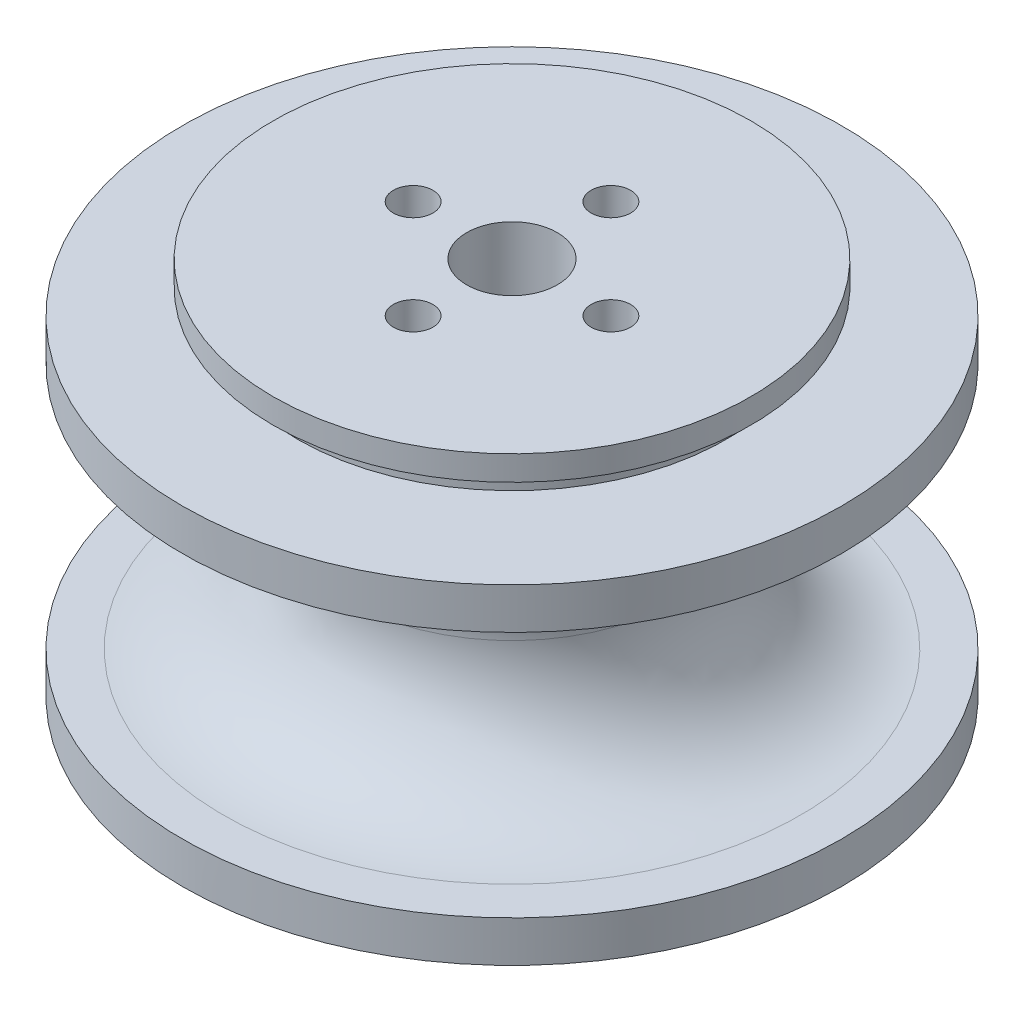
ISO-10303-21;
HEADER;
FILE_DESCRIPTION(('STEP AP214'),'2;1');
FILE_NAME('part.step','',(''),(''),'','','');
FILE_SCHEMA(('AUTOMOTIVE_DESIGN { 1 0 10303 214 1 1 1 1 }'));
ENDSEC;
DATA;
#1=APPLICATION_CONTEXT('core data for automotive mechanical design processes');
#2=APPLICATION_PROTOCOL_DEFINITION('international standard','automotive_design',2000,#1);
#3=PRODUCT_CONTEXT('',#1,'mechanical');
#4=PRODUCT('Part','Part','',(#3));
#5=PRODUCT_RELATED_PRODUCT_CATEGORY('part','',(#4));
#6=PRODUCT_DEFINITION_FORMATION('','',#4);
#7=PRODUCT_DEFINITION_CONTEXT('part definition',#1,'design');
#8=PRODUCT_DEFINITION('design','',#6,#7);
#9=PRODUCT_DEFINITION_SHAPE('','',#8);
#10=(LENGTH_UNIT() NAMED_UNIT(*) SI_UNIT(.MILLI.,.METRE.));
#11=(NAMED_UNIT(*) PLANE_ANGLE_UNIT() SI_UNIT($,.RADIAN.));
#12=(NAMED_UNIT(*) SI_UNIT($,.STERADIAN.) SOLID_ANGLE_UNIT());
#13=UNCERTAINTY_MEASURE_WITH_UNIT(LENGTH_MEASURE(1.E-05),#10,'distance_accuracy_value','');
#14=(GEOMETRIC_REPRESENTATION_CONTEXT(3) GLOBAL_UNCERTAINTY_ASSIGNED_CONTEXT((#13)) GLOBAL_UNIT_ASSIGNED_CONTEXT((#10,
#11,#12)) REPRESENTATION_CONTEXT('',''));
#15=CARTESIAN_POINT('',(0.,0.,0.));
#16=DIRECTION('',(0.,0.,1.));
#17=DIRECTION('',(1.,0.,0.));
#18=AXIS2_PLACEMENT_3D('',#15,#16,#17);
#19=CARTESIAN_POINT('',(0.,40.,0.));
#20=DIRECTION('',(0.,-1.,0.));
#21=DIRECTION('',(0.,0.,-1.));
#22=AXIS2_PLACEMENT_3D('',#19,#20,#21);
#23=CYLINDRICAL_SURFACE('',#22,40.);
#24=CARTESIAN_POINT('',(0.,0.,0.));
#25=DIRECTION('',(0.,1.,0.));
#26=DIRECTION('',(0.,0.,1.));
#27=AXIS2_PLACEMENT_3D('',#24,#25,#26);
#28=CIRCLE('',#27,40.);
#29=CARTESIAN_POINT('',(0.,0.,40.));
#30=VERTEX_POINT('',#29);
#31=EDGE_CURVE('E77',#30,#30,#28,.T.);
#32=ORIENTED_EDGE('',*,*,#31,.T.);
#33=EDGE_LOOP('',(#32));
#34=FACE_BOUND('',#33,.T.);
#35=CARTESIAN_POINT('',(1.20058714961001E-13,5.00000000000012,0.));
#36=DIRECTION('',(0.,-1.,0.));
#37=DIRECTION('',(1.,0.,0.));
#38=AXIS2_PLACEMENT_3D('',#35,#36,#37);
#39=CIRCLE('',#38,40.0000000000001);
#40=CARTESIAN_POINT('',(40.0000000000002,5.00000000000025,0.));
#41=VERTEX_POINT('',#40);
#42=EDGE_CURVE('E104',#41,#41,#39,.T.);
#43=ORIENTED_EDGE('',*,*,#42,.T.);
#44=EDGE_LOOP('',(#43));
#45=FACE_BOUND('',#44,.T.);
#46=ADVANCED_FACE('F43',(#34,#45),#23,.T.);
#47=CARTESIAN_POINT('',(0.,0.,0.));
#48=DIRECTION('',(0.,1.,0.));
#49=DIRECTION('',(0.,0.,1.));
#50=AXIS2_PLACEMENT_3D('',#47,#48,#49);
#51=PLANE('',#50);
#52=CARTESIAN_POINT('',(0.,0.,0.));
#53=DIRECTION('',(0.,-1.,0.));
#54=DIRECTION('',(0.,0.,-1.));
#55=AXIS2_PLACEMENT_3D('',#52,#53,#54);
#56=CIRCLE('',#55,26.);
#57=CARTESIAN_POINT('',(0.,0.,-26.));
#58=VERTEX_POINT('',#57);
#59=EDGE_CURVE('E67',#58,#58,#56,.T.);
#60=ORIENTED_EDGE('',*,*,#59,.F.);
#61=EDGE_LOOP('',(#60));
#62=FACE_BOUND('',#61,.T.);
#63=ORIENTED_EDGE('',*,*,#31,.F.);
#64=EDGE_LOOP('',(#63));
#65=FACE_BOUND('',#64,.T.);
#66=ADVANCED_FACE('F200',(#62,#65),#51,.F.);
#67=CARTESIAN_POINT('',(0.,-3.,0.));
#68=DIRECTION('',(0.,1.,0.));
#69=DIRECTION('',(0.,0.,1.));
#70=AXIS2_PLACEMENT_3D('',#67,#68,#69);
#71=CYLINDRICAL_SURFACE('',#70,26.);
#72=CARTESIAN_POINT('',(0.,-2.,0.));
#73=DIRECTION('',(0.,-1.,0.));
#74=DIRECTION('',(0.,0.,-1.));
#75=AXIS2_PLACEMENT_3D('',#72,#73,#74);
#76=CIRCLE('',#75,26.);
#77=CARTESIAN_POINT('',(0.,-2.,-26.));
#78=VERTEX_POINT('',#77);
#79=EDGE_CURVE('E57',#78,#78,#76,.F.);
#80=ORIENTED_EDGE('',*,*,#79,.T.);
#81=EDGE_LOOP('',(#80));
#82=FACE_BOUND('',#81,.T.);
#83=ORIENTED_EDGE('',*,*,#59,.T.);
#84=EDGE_LOOP('',(#83));
#85=FACE_BOUND('',#84,.T.);
#86=ADVANCED_FACE('F184',(#82,#85),#71,.T.);
#87=CARTESIAN_POINT('',(0.,-6.,0.));
#88=DIRECTION('',(0.,1.,0.));
#89=DIRECTION('',(0.,0.,1.));
#90=AXIS2_PLACEMENT_3D('',#87,#88,#89);
#91=CYLINDRICAL_SURFACE('',#90,28.);
#92=CARTESIAN_POINT('',(0.,-6.,0.));
#93=DIRECTION('',(0.,-1.,0.));
#94=DIRECTION('',(0.,0.,-1.));
#95=AXIS2_PLACEMENT_3D('',#92,#93,#94);
#96=CIRCLE('',#95,28.);
#97=CARTESIAN_POINT('',(0.,-6.,-28.));
#98=VERTEX_POINT('',#97);
#99=EDGE_CURVE('E93',#98,#98,#96,.T.);
#100=ORIENTED_EDGE('',*,*,#99,.F.);
#101=EDGE_LOOP('',(#100));
#102=FACE_BOUND('',#101,.T.);
#103=CARTESIAN_POINT('',(0.,-3.,0.));
#104=DIRECTION('',(0.,-1.,0.));
#105=DIRECTION('',(0.,0.,-1.));
#106=AXIS2_PLACEMENT_3D('',#103,#104,#105);
#107=CIRCLE('',#106,28.);
#108=CARTESIAN_POINT('',(0.,-3.,-28.));
#109=VERTEX_POINT('',#108);
#110=EDGE_CURVE('E100',#109,#109,#107,.T.);
#111=ORIENTED_EDGE('',*,*,#110,.T.);
#112=EDGE_LOOP('',(#111));
#113=FACE_BOUND('',#112,.T.);
#114=ADVANCED_FACE('F170',(#102,#113),#91,.T.);
#115=CARTESIAN_POINT('',(0.,-6.,0.));
#116=DIRECTION('',(0.,-1.,0.));
#117=DIRECTION('',(0.,0.,-1.));
#118=AXIS2_PLACEMENT_3D('',#115,#116,#117);
#119=PLANE('',#118);
#120=CARTESIAN_POINT('',(0.,-6.,12.));
#121=DIRECTION('',(0.,-1.,0.));
#122=DIRECTION('',(0.,0.,-1.));
#123=AXIS2_PLACEMENT_3D('',#120,#121,#122);
#124=CIRCLE('',#123,2.4);
#125=CARTESIAN_POINT('',(0.,-6.,9.6));
#126=VERTEX_POINT('',#125);
#127=EDGE_CURVE('E148',#126,#126,#124,.T.);
#128=ORIENTED_EDGE('',*,*,#127,.F.);
#129=EDGE_LOOP('',(#128));
#130=FACE_BOUND('',#129,.T.);
#131=CARTESIAN_POINT('',(-12.,-6.,1.25693328198353E-13));
#132=DIRECTION('',(0.,-1.,0.));
#133=DIRECTION('',(0.,0.,-1.));
#134=AXIS2_PLACEMENT_3D('',#131,#132,#133);
#135=CIRCLE('',#134,2.4);
#136=CARTESIAN_POINT('',(-12.,-6.,-2.39999999999987));
#137=VERTEX_POINT('',#136);
#138=EDGE_CURVE('E144',#137,#137,#135,.T.);
#139=ORIENTED_EDGE('',*,*,#138,.F.);
#140=EDGE_LOOP('',(#139));
#141=FACE_BOUND('',#140,.T.);
#142=CARTESIAN_POINT('',(0.,-6.,-12.));
#143=DIRECTION('',(0.,-1.,0.));
#144=DIRECTION('',(0.,0.,-1.));
#145=AXIS2_PLACEMENT_3D('',#142,#143,#144);
#146=CIRCLE('',#145,2.4);
#147=CARTESIAN_POINT('',(0.,-6.,-14.4));
#148=VERTEX_POINT('',#147);
#149=EDGE_CURVE('E136',#148,#148,#146,.T.);
#150=ORIENTED_EDGE('',*,*,#149,.F.);
#151=EDGE_LOOP('',(#150));
#152=FACE_BOUND('',#151,.T.);
#153=CARTESIAN_POINT('',(12.,-6.,0.));
#154=DIRECTION('',(0.,-1.,0.));
#155=DIRECTION('',(0.,0.,-1.));
#156=AXIS2_PLACEMENT_3D('',#153,#154,#155);
#157=CIRCLE('',#156,2.4);
#158=CARTESIAN_POINT('',(12.,-6.,-2.40000000000004));
#159=VERTEX_POINT('',#158);
#160=EDGE_CURVE('E128',#159,#159,#157,.T.);
#161=ORIENTED_EDGE('',*,*,#160,.F.);
#162=EDGE_LOOP('',(#161));
#163=FACE_BOUND('',#162,.T.);
#164=CARTESIAN_POINT('',(0.,-6.,0.));
#165=DIRECTION('',(0.,-1.,0.));
#166=DIRECTION('',(0.,0.,-1.));
#167=AXIS2_PLACEMENT_3D('',#164,#165,#166);
#168=CIRCLE('',#167,5.5);
#169=CARTESIAN_POINT('',(0.,-6.,-5.5));
#170=VERTEX_POINT('',#169);
#171=EDGE_CURVE('E115',#170,#170,#168,.T.);
#172=ORIENTED_EDGE('',*,*,#171,.F.);
#173=EDGE_LOOP('',(#172));
#174=FACE_BOUND('',#173,.T.);
#175=ORIENTED_EDGE('',*,*,#99,.T.);
#176=EDGE_LOOP('',(#175));
#177=FACE_BOUND('',#176,.T.);
#178=ADVANCED_FACE('F166',(#130,#141,#152,#163,#174,#177),#119,.T.);
#179=CARTESIAN_POINT('',(0.,-3.,0.));
#180=DIRECTION('',(0.,-1.,0.));
#181=DIRECTION('',(0.,0.,-1.));
#182=AXIS2_PLACEMENT_3D('',#179,#180,#181);
#183=PLANE('',#182);
#184=CARTESIAN_POINT('',(0.,-3.,0.));
#185=DIRECTION('',(0.,-1.,0.));
#186=DIRECTION('',(0.,0.,-1.));
#187=AXIS2_PLACEMENT_3D('',#184,#185,#186);
#188=CIRCLE('',#187,27.);
#189=CARTESIAN_POINT('',(0.,-3.,-27.));
#190=VERTEX_POINT('',#189);
#191=EDGE_CURVE('E63',#190,#190,#188,.T.);
#192=ORIENTED_EDGE('',*,*,#191,.T.);
#193=EDGE_LOOP('',(#192));
#194=FACE_BOUND('',#193,.T.);
#195=ORIENTED_EDGE('',*,*,#110,.F.);
#196=EDGE_LOOP('',(#195));
#197=FACE_BOUND('',#196,.T.);
#198=ADVANCED_FACE('F169',(#194,#197),#183,.F.);
#199=CARTESIAN_POINT('',(0.,-2.,0.));
#200=DIRECTION('',(0.,-1.,0.));
#201=DIRECTION('',(0.,0.,-1.));
#202=AXIS2_PLACEMENT_3D('',#199,#200,#201);
#203=TOROIDAL_SURFACE('',#202,27.,1.);
#204=ORIENTED_EDGE('',*,*,#79,.F.);
#205=EDGE_LOOP('',(#204));
#206=FACE_BOUND('',#205,.T.);
#207=ORIENTED_EDGE('',*,*,#191,.F.);
#208=EDGE_LOOP('',(#207));
#209=FACE_BOUND('',#208,.T.);
#210=ADVANCED_FACE('F189',(#206,#209),#203,.F.);
#211=CARTESIAN_POINT('',(-40.,4.99999999999996,0.));
#212=DIRECTION('',(0.,1.,0.));
#213=DIRECTION('',(-1.,0.,0.));
#214=AXIS2_PLACEMENT_3D('',#211,#212,#213);
#215=PLANE('',#214);
#216=CARTESIAN_POINT('',(1.20058714961001E-13,5.0000000000001,0.));
#217=DIRECTION('',(0.,1.,0.));
#218=DIRECTION('',(-1.,0.,0.));
#219=AXIS2_PLACEMENT_3D('',#216,#217,#218);
#220=CIRCLE('',#219,35.0000000000001);
#221=CARTESIAN_POINT('',(-35.,4.99999999999998,0.));
#222=VERTEX_POINT('',#221);
#223=EDGE_CURVE('E52',#222,#222,#220,.F.);
#224=ORIENTED_EDGE('',*,*,#223,.T.);
#225=EDGE_LOOP('',(#224));
#226=FACE_BOUND('',#225,.T.);
#227=ORIENTED_EDGE('',*,*,#42,.F.);
#228=EDGE_LOOP('',(#227));
#229=FACE_BOUND('',#228,.T.);
#230=ADVANCED_FACE('F196',(#226,#229),#215,.T.);
#231=CARTESIAN_POINT('',(-40.,35.,0.));
#232=DIRECTION('',(0.,-1.,0.));
#233=DIRECTION('',(1.,0.,0.));
#234=AXIS2_PLACEMENT_3D('',#231,#232,#233);
#235=PLANE('',#234);
#236=CARTESIAN_POINT('',(0.,35.0000000000001,0.));
#237=DIRECTION('',(0.,-1.,0.));
#238=DIRECTION('',(1.,0.,0.));
#239=AXIS2_PLACEMENT_3D('',#236,#237,#238);
#240=CIRCLE('',#239,35.0000000000001);
#241=CARTESIAN_POINT('',(35.0000000000001,35.0000000000002,0.));
#242=VERTEX_POINT('',#241);
#243=EDGE_CURVE('E10',#242,#242,#240,.F.);
#244=ORIENTED_EDGE('',*,*,#243,.T.);
#245=EDGE_LOOP('',(#244));
#246=FACE_BOUND('',#245,.T.);
#247=CARTESIAN_POINT('',(0.,35.0000000000001,0.));
#248=DIRECTION('',(0.,-1.,0.));
#249=DIRECTION('',(1.,0.,0.));
#250=AXIS2_PLACEMENT_3D('',#247,#248,#249);
#251=CIRCLE('',#250,40.);
#252=CARTESIAN_POINT('',(40.,35.0000000000003,0.));
#253=VERTEX_POINT('',#252);
#254=EDGE_CURVE('E111',#253,#253,#251,.T.);
#255=ORIENTED_EDGE('',*,*,#254,.T.);
#256=EDGE_LOOP('',(#255));
#257=FACE_BOUND('',#256,.T.);
#258=ADVANCED_FACE('F228',(#246,#257),#235,.T.);
#259=CARTESIAN_POINT('',(0.,46.,0.));
#260=DIRECTION('',(0.,1.,0.));
#261=DIRECTION('',(0.,0.,1.));
#262=AXIS2_PLACEMENT_3D('',#259,#260,#261);
#263=PLANE('',#262);
#264=CARTESIAN_POINT('',(0.,46.,12.));
#265=DIRECTION('',(0.,-1.,0.));
#266=DIRECTION('',(0.,0.,-1.));
#267=AXIS2_PLACEMENT_3D('',#264,#265,#266);
#268=CIRCLE('',#267,2.4);
#269=CARTESIAN_POINT('',(0.,46.,9.6));
#270=VERTEX_POINT('',#269);
#271=EDGE_CURVE('E120',#270,#270,#268,.T.);
#272=ORIENTED_EDGE('',*,*,#271,.T.);
#273=EDGE_LOOP('',(#272));
#274=FACE_BOUND('',#273,.T.);
#275=CARTESIAN_POINT('',(-12.,46.,1.25693328198353E-13));
#276=DIRECTION('',(0.,-1.,0.));
#277=DIRECTION('',(0.,0.,-1.));
#278=AXIS2_PLACEMENT_3D('',#275,#276,#277);
#279=CIRCLE('',#278,2.4);
#280=CARTESIAN_POINT('',(-12.,46.,-2.39999999999987));
#281=VERTEX_POINT('',#280);
#282=EDGE_CURVE('E140',#281,#281,#279,.T.);
#283=ORIENTED_EDGE('',*,*,#282,.T.);
#284=EDGE_LOOP('',(#283));
#285=FACE_BOUND('',#284,.T.);
#286=CARTESIAN_POINT('',(0.,46.,-12.));
#287=DIRECTION('',(0.,-1.,0.));
#288=DIRECTION('',(0.,0.,-1.));
#289=AXIS2_PLACEMENT_3D('',#286,#287,#288);
#290=CIRCLE('',#289,2.4);
#291=CARTESIAN_POINT('',(0.,46.,-14.4));
#292=VERTEX_POINT('',#291);
#293=EDGE_CURVE('E132',#292,#292,#290,.T.);
#294=ORIENTED_EDGE('',*,*,#293,.T.);
#295=EDGE_LOOP('',(#294));
#296=FACE_BOUND('',#295,.T.);
#297=CARTESIAN_POINT('',(12.,46.,0.));
#298=DIRECTION('',(0.,-1.,0.));
#299=DIRECTION('',(0.,0.,-1.));
#300=AXIS2_PLACEMENT_3D('',#297,#298,#299);
#301=CIRCLE('',#300,2.4);
#302=CARTESIAN_POINT('',(12.,46.,-2.40000000000004));
#303=VERTEX_POINT('',#302);
#304=EDGE_CURVE('E124',#303,#303,#301,.T.);
#305=ORIENTED_EDGE('',*,*,#304,.T.);
#306=EDGE_LOOP('',(#305));
#307=FACE_BOUND('',#306,.T.);
#308=CARTESIAN_POINT('',(0.,46.,0.));
#309=DIRECTION('',(0.,-1.,0.));
#310=DIRECTION('',(0.,0.,-1.));
#311=AXIS2_PLACEMENT_3D('',#308,#309,#310);
#312=CIRCLE('',#311,5.5);
#313=CARTESIAN_POINT('',(0.,46.,-5.5));
#314=VERTEX_POINT('',#313);
#315=EDGE_CURVE('E119',#314,#314,#312,.T.);
#316=ORIENTED_EDGE('',*,*,#315,.T.);
#317=EDGE_LOOP('',(#316));
#318=FACE_BOUND('',#317,.T.);
#319=CARTESIAN_POINT('',(0.,46.,0.));
#320=DIRECTION('',(0.,1.,0.));
#321=DIRECTION('',(0.,0.,1.));
#322=AXIS2_PLACEMENT_3D('',#319,#320,#321);
#323=CIRCLE('',#322,29.);
#324=CARTESIAN_POINT('',(0.,46.,29.));
#325=VERTEX_POINT('',#324);
#326=EDGE_CURVE('E82',#325,#325,#323,.T.);
#327=ORIENTED_EDGE('',*,*,#326,.T.);
#328=EDGE_LOOP('',(#327));
#329=FACE_BOUND('',#328,.T.);
#330=ADVANCED_FACE('F156',(#274,#285,#296,#307,#318,#329),#263,.T.);
#331=CARTESIAN_POINT('',(0.,46.,0.));
#332=DIRECTION('',(0.,-1.,0.));
#333=DIRECTION('',(0.,0.,-1.));
#334=AXIS2_PLACEMENT_3D('',#331,#332,#333);
#335=CYLINDRICAL_SURFACE('',#334,29.);
#336=ORIENTED_EDGE('',*,*,#326,.F.);
#337=EDGE_LOOP('',(#336));
#338=FACE_BOUND('',#337,.T.);
#339=CARTESIAN_POINT('',(0.,43.,0.));
#340=DIRECTION('',(0.,1.,0.));
#341=DIRECTION('',(0.,0.,1.));
#342=AXIS2_PLACEMENT_3D('',#339,#340,#341);
#343=CIRCLE('',#342,29.);
#344=CARTESIAN_POINT('',(0.,43.,29.));
#345=VERTEX_POINT('',#344);
#346=EDGE_CURVE('E89',#345,#345,#343,.T.);
#347=ORIENTED_EDGE('',*,*,#346,.T.);
#348=EDGE_LOOP('',(#347));
#349=FACE_BOUND('',#348,.T.);
#350=ADVANCED_FACE('F234',(#338,#349),#335,.T.);
#351=CARTESIAN_POINT('',(0.,43.,0.));
#352=DIRECTION('',(0.,1.,0.));
#353=DIRECTION('',(0.,0.,1.));
#354=AXIS2_PLACEMENT_3D('',#351,#352,#353);
#355=PLANE('',#354);
#356=CARTESIAN_POINT('',(0.,43.,0.));
#357=DIRECTION('',(0.,1.,0.));
#358=DIRECTION('',(0.,0.,1.));
#359=AXIS2_PLACEMENT_3D('',#356,#357,#358);
#360=CIRCLE('',#359,27.);
#361=CARTESIAN_POINT('',(0.,43.,27.));
#362=VERTEX_POINT('',#361);
#363=EDGE_CURVE('E72',#362,#362,#360,.T.);
#364=ORIENTED_EDGE('',*,*,#363,.T.);
#365=EDGE_LOOP('',(#364));
#366=FACE_BOUND('',#365,.T.);
#367=ORIENTED_EDGE('',*,*,#346,.F.);
#368=EDGE_LOOP('',(#367));
#369=FACE_BOUND('',#368,.T.);
#370=ADVANCED_FACE('F268',(#366,#369),#355,.F.);
#371=CARTESIAN_POINT('',(0.,42.,0.));
#372=DIRECTION('',(0.,1.,0.));
#373=DIRECTION('',(0.,0.,1.));
#374=AXIS2_PLACEMENT_3D('',#371,#372,#373);
#375=TOROIDAL_SURFACE('',#374,27.,1.);
#376=CARTESIAN_POINT('',(0.,42.,0.));
#377=DIRECTION('',(0.,1.,0.));
#378=DIRECTION('',(0.,0.,1.));
#379=AXIS2_PLACEMENT_3D('',#376,#377,#378);
#380=CIRCLE('',#379,26.);
#381=CARTESIAN_POINT('',(0.,42.,26.));
#382=VERTEX_POINT('',#381);
#383=EDGE_CURVE('E68',#382,#382,#380,.F.);
#384=ORIENTED_EDGE('',*,*,#383,.F.);
#385=EDGE_LOOP('',(#384));
#386=FACE_BOUND('',#385,.T.);
#387=ORIENTED_EDGE('',*,*,#363,.F.);
#388=EDGE_LOOP('',(#387));
#389=FACE_BOUND('',#388,.T.);
#390=ADVANCED_FACE('F273',(#386,#389),#375,.F.);
#391=CARTESIAN_POINT('',(0.,43.,0.));
#392=DIRECTION('',(0.,-1.,0.));
#393=DIRECTION('',(0.,0.,-1.));
#394=AXIS2_PLACEMENT_3D('',#391,#392,#393);
#395=CYLINDRICAL_SURFACE('',#394,26.);
#396=ORIENTED_EDGE('',*,*,#383,.T.);
#397=EDGE_LOOP('',(#396));
#398=FACE_BOUND('',#397,.T.);
#399=CARTESIAN_POINT('',(0.,40.,0.));
#400=DIRECTION('',(0.,1.,0.));
#401=DIRECTION('',(0.,0.,1.));
#402=AXIS2_PLACEMENT_3D('',#399,#400,#401);
#403=CIRCLE('',#402,26.);
#404=CARTESIAN_POINT('',(0.,40.,26.));
#405=VERTEX_POINT('',#404);
#406=EDGE_CURVE('E76',#405,#405,#403,.T.);
#407=ORIENTED_EDGE('',*,*,#406,.T.);
#408=EDGE_LOOP('',(#407));
#409=FACE_BOUND('',#408,.T.);
#410=ADVANCED_FACE('F221',(#398,#409),#395,.T.);
#411=CARTESIAN_POINT('',(0.,40.,0.));
#412=DIRECTION('',(0.,1.,0.));
#413=DIRECTION('',(0.,0.,1.));
#414=AXIS2_PLACEMENT_3D('',#411,#412,#413);
#415=PLANE('',#414);
#416=ORIENTED_EDGE('',*,*,#406,.F.);
#417=EDGE_LOOP('',(#416));
#418=FACE_BOUND('',#417,.T.);
#419=CARTESIAN_POINT('',(0.,40.,0.));
#420=DIRECTION('',(0.,1.,0.));
#421=DIRECTION('',(0.,0.,1.));
#422=AXIS2_PLACEMENT_3D('',#419,#420,#421);
#423=CIRCLE('',#422,40.);
#424=CARTESIAN_POINT('',(0.,40.,40.));
#425=VERTEX_POINT('',#424);
#426=EDGE_CURVE('E81',#425,#425,#423,.T.);
#427=ORIENTED_EDGE('',*,*,#426,.T.);
#428=EDGE_LOOP('',(#427));
#429=FACE_BOUND('',#428,.T.);
#430=ADVANCED_FACE('F212',(#418,#429),#415,.T.);
#431=ORIENTED_EDGE('',*,*,#426,.F.);
#432=EDGE_LOOP('',(#431));
#433=FACE_BOUND('',#432,.T.);
#434=ORIENTED_EDGE('',*,*,#254,.F.);
#435=EDGE_LOOP('',(#434));
#436=FACE_BOUND('',#435,.T.);
#437=ADVANCED_FACE('F203',(#433,#436),#23,.T.);
#438=CARTESIAN_POINT('',(0.,20.0000000000001,0.));
#439=DIRECTION('',(0.,-1.,0.));
#440=DIRECTION('',(1.,0.,0.));
#441=AXIS2_PLACEMENT_3D('',#438,#439,#440);
#442=TOROIDAL_SURFACE('',#441,35.0000000000001,15.);
#443=ORIENTED_EDGE('',*,*,#243,.F.);
#444=EDGE_LOOP('',(#443));
#445=FACE_BOUND('',#444,.T.);
#446=CARTESIAN_POINT('',(0.,20.0000000000001,0.));
#447=DIRECTION('',(0.,-1.,0.));
#448=DIRECTION('',(1.,0.,0.));
#449=AXIS2_PLACEMENT_3D('',#446,#447,#448);
#450=CIRCLE('',#449,20.0000000000001);
#451=CARTESIAN_POINT('',(20.0000000000001,20.0000000000002,0.));
#452=VERTEX_POINT('',#451);
#453=EDGE_CURVE('E47',#452,#452,#450,.T.);
#454=ORIENTED_EDGE('',*,*,#453,.F.);
#455=EDGE_LOOP('',(#454));
#456=FACE_BOUND('',#455,.T.);
#457=ADVANCED_FACE('F45',(#445,#456),#442,.F.);
#458=CARTESIAN_POINT('',(0.,20.0000000000001,0.));
#459=DIRECTION('',(0.,1.,0.));
#460=DIRECTION('',(-1.,0.,0.));
#461=AXIS2_PLACEMENT_3D('',#458,#459,#460);
#462=TOROIDAL_SURFACE('',#461,35.0000000000001,15.);
#463=ORIENTED_EDGE('',*,*,#453,.T.);
#464=EDGE_LOOP('',(#463));
#465=FACE_BOUND('',#464,.T.);
#466=ORIENTED_EDGE('',*,*,#223,.F.);
#467=EDGE_LOOP('',(#466));
#468=FACE_BOUND('',#467,.T.);
#469=ADVANCED_FACE('F218',(#465,#468),#462,.F.);
#470=CARTESIAN_POINT('',(0.,46.,0.));
#471=DIRECTION('',(0.,-1.,0.));
#472=DIRECTION('',(0.,0.,-1.));
#473=AXIS2_PLACEMENT_3D('',#470,#471,#472);
#474=CYLINDRICAL_SURFACE('',#473,5.5);
#475=ORIENTED_EDGE('',*,*,#315,.F.);
#476=EDGE_LOOP('',(#475));
#477=FACE_BOUND('',#476,.T.);
#478=ORIENTED_EDGE('',*,*,#171,.T.);
#479=EDGE_LOOP('',(#478));
#480=FACE_BOUND('',#479,.T.);
#481=ADVANCED_FACE('F239',(#477,#480),#474,.F.);
#482=CARTESIAN_POINT('',(12.,46.,0.));
#483=DIRECTION('',(0.,-1.,0.));
#484=DIRECTION('',(0.,0.,-1.));
#485=AXIS2_PLACEMENT_3D('',#482,#483,#484);
#486=CYLINDRICAL_SURFACE('',#485,2.4);
#487=ORIENTED_EDGE('',*,*,#304,.F.);
#488=EDGE_LOOP('',(#487));
#489=FACE_BOUND('',#488,.T.);
#490=ORIENTED_EDGE('',*,*,#160,.T.);
#491=EDGE_LOOP('',(#490));
#492=FACE_BOUND('',#491,.T.);
#493=ADVANCED_FACE('F242',(#489,#492),#486,.F.);
#494=CARTESIAN_POINT('',(0.,46.,-12.));
#495=DIRECTION('',(0.,-1.,0.));
#496=DIRECTION('',(0.,0.,-1.));
#497=AXIS2_PLACEMENT_3D('',#494,#495,#496);
#498=CYLINDRICAL_SURFACE('',#497,2.4);
#499=ORIENTED_EDGE('',*,*,#293,.F.);
#500=EDGE_LOOP('',(#499));
#501=FACE_BOUND('',#500,.T.);
#502=ORIENTED_EDGE('',*,*,#149,.T.);
#503=EDGE_LOOP('',(#502));
#504=FACE_BOUND('',#503,.T.);
#505=ADVANCED_FACE('F246',(#501,#504),#498,.F.);
#506=CARTESIAN_POINT('',(-12.,46.,1.25693328198353E-13));
#507=DIRECTION('',(0.,-1.,0.));
#508=DIRECTION('',(0.,0.,-1.));
#509=AXIS2_PLACEMENT_3D('',#506,#507,#508);
#510=CYLINDRICAL_SURFACE('',#509,2.4);
#511=ORIENTED_EDGE('',*,*,#282,.F.);
#512=EDGE_LOOP('',(#511));
#513=FACE_BOUND('',#512,.T.);
#514=ORIENTED_EDGE('',*,*,#138,.T.);
#515=EDGE_LOOP('',(#514));
#516=FACE_BOUND('',#515,.T.);
#517=ADVANCED_FACE('F162',(#513,#516),#510,.F.);
#518=CARTESIAN_POINT('',(0.,46.,12.));
#519=DIRECTION('',(0.,-1.,0.));
#520=DIRECTION('',(0.,0.,-1.));
#521=AXIS2_PLACEMENT_3D('',#518,#519,#520);
#522=CYLINDRICAL_SURFACE('',#521,2.4);
#523=ORIENTED_EDGE('',*,*,#271,.F.);
#524=EDGE_LOOP('',(#523));
#525=FACE_BOUND('',#524,.T.);
#526=ORIENTED_EDGE('',*,*,#127,.T.);
#527=EDGE_LOOP('',(#526));
#528=FACE_BOUND('',#527,.T.);
#529=ADVANCED_FACE('F159',(#525,#528),#522,.F.);
#530=CLOSED_SHELL('',(#46,#66,#86,#114,#178,#198,#210,#230,#258,#330,#350,#370,#390,#410,#430,
#437,#457,#469,#481,#493,#505,#517,#529));
#531=MANIFOLD_SOLID_BREP('B2',#530);
#532=ADVANCED_BREP_SHAPE_REPRESENTATION('',(#18,#531),#14);
#533=SHAPE_DEFINITION_REPRESENTATION(#9,#532);
ENDSEC;
END-ISO-10303-21;
